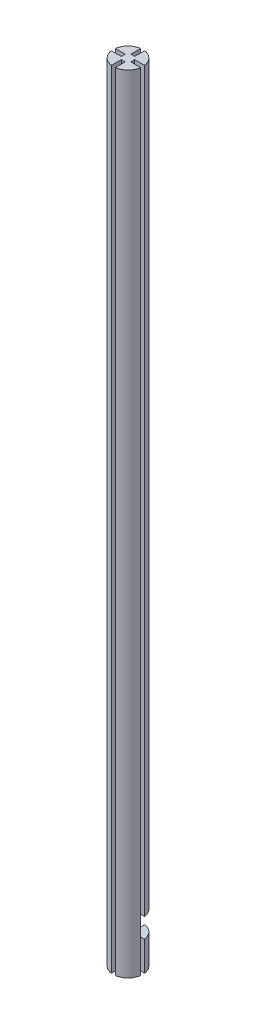
ISO-10303-21;
HEADER;
FILE_DESCRIPTION(('STEP AP214'),'2;1');
FILE_NAME('part.step','',(''),(''),'','','');
FILE_SCHEMA(('AUTOMOTIVE_DESIGN { 1 0 10303 214 1 1 1 1 }'));
ENDSEC;
DATA;
#1=APPLICATION_CONTEXT('core data for automotive mechanical design processes');
#2=APPLICATION_PROTOCOL_DEFINITION('international standard','automotive_design',2000,#1);
#3=PRODUCT_CONTEXT('',#1,'mechanical');
#4=PRODUCT('Part','Part','',(#3));
#5=PRODUCT_RELATED_PRODUCT_CATEGORY('part','',(#4));
#6=PRODUCT_DEFINITION_FORMATION('','',#4);
#7=PRODUCT_DEFINITION_CONTEXT('part definition',#1,'design');
#8=PRODUCT_DEFINITION('design','',#6,#7);
#9=PRODUCT_DEFINITION_SHAPE('','',#8);
#10=(LENGTH_UNIT() NAMED_UNIT(*) SI_UNIT(.MILLI.,.METRE.));
#11=(NAMED_UNIT(*) PLANE_ANGLE_UNIT() SI_UNIT($,.RADIAN.));
#12=(NAMED_UNIT(*) SI_UNIT($,.STERADIAN.) SOLID_ANGLE_UNIT());
#13=UNCERTAINTY_MEASURE_WITH_UNIT(LENGTH_MEASURE(1.E-05),#10,'distance_accuracy_value','');
#14=(GEOMETRIC_REPRESENTATION_CONTEXT(3) GLOBAL_UNCERTAINTY_ASSIGNED_CONTEXT((#13)) GLOBAL_UNIT_ASSIGNED_CONTEXT((#10,
#11,#12)) REPRESENTATION_CONTEXT('',''));
#15=CARTESIAN_POINT('',(0.,0.,0.));
#16=DIRECTION('',(0.,0.,1.));
#17=DIRECTION('',(1.,0.,0.));
#18=AXIS2_PLACEMENT_3D('',#15,#16,#17);
#19=CARTESIAN_POINT('',(74.3303437365925,4000.,-10.));
#20=DIRECTION('',(0.,0.,1.));
#21=DIRECTION('',(1.,0.,0.));
#22=AXIS2_PLACEMENT_3D('',#19,#20,#21);
#23=PLANE('',#22);
#24=DIRECTION('',(0.,-1.,0.));
#25=VECTOR('',#24,1.);
#26=CARTESIAN_POINT('',(74.3303437365925,4000.,-10.));
#27=LINE('',#26,#25);
#28=CARTESIAN_POINT('',(74.3303437365925,150.,-10.0000000000001));
#29=VERTEX_POINT('',#28);
#30=CARTESIAN_POINT('',(74.3303437365925,0.,-10.));
#31=VERTEX_POINT('',#30);
#32=EDGE_CURVE('E266',#29,#31,#27,.T.);
#33=ORIENTED_EDGE('',*,*,#32,.F.);
#34=DIRECTION('',(-1.,0.,0.));
#35=VECTOR('',#34,1.);
#36=CARTESIAN_POINT('',(74.3303437365925,150.,-10.));
#37=LINE('',#36,#35);
#38=CARTESIAN_POINT('',(24.3303437365925,150.,-10.));
#39=VERTEX_POINT('',#38);
#40=EDGE_CURVE('E378',#29,#39,#37,.T.);
#41=ORIENTED_EDGE('',*,*,#40,.T.);
#42=DIRECTION('',(0.,-1.,0.));
#43=VECTOR('',#42,1.);
#44=CARTESIAN_POINT('',(24.3303437365925,4000.,-10.));
#45=LINE('',#44,#43);
#46=CARTESIAN_POINT('',(24.3303437365925,0.,-10.));
#47=VERTEX_POINT('',#46);
#48=EDGE_CURVE('E262',#39,#47,#45,.T.);
#49=ORIENTED_EDGE('',*,*,#48,.T.);
#50=DIRECTION('',(-1.,0.,0.));
#51=VECTOR('',#50,1.);
#52=CARTESIAN_POINT('',(74.3303437365925,0.,-10.));
#53=LINE('',#52,#51);
#54=EDGE_CURVE('E208',#31,#47,#53,.T.);
#55=ORIENTED_EDGE('',*,*,#54,.F.);
#56=EDGE_LOOP('',(#33,#41,#49,#55));
#57=FACE_BOUND('',#56,.T.);
#58=ADVANCED_FACE('F34',(#57),#23,.T.);
#59=CARTESIAN_POINT('',(0.,4000.,0.));
#60=DIRECTION('',(0.,-1.,0.));
#61=DIRECTION('',(0.,0.,-1.));
#62=AXIS2_PLACEMENT_3D('',#59,#60,#61);
#63=CYLINDRICAL_SURFACE('',#62,75.);
#64=CARTESIAN_POINT('',(0.,150.,0.));
#65=DIRECTION('',(0.,1.,0.));
#66=DIRECTION('',(0.,0.,1.));
#67=AXIS2_PLACEMENT_3D('',#64,#65,#66);
#68=CIRCLE('',#67,75.);
#69=CARTESIAN_POINT('',(10.,150.,-74.3303437365925));
#70=VERTEX_POINT('',#69);
#71=EDGE_CURVE('E381',#29,#70,#68,.T.);
#72=ORIENTED_EDGE('',*,*,#71,.F.);
#73=ORIENTED_EDGE('',*,*,#32,.T.);
#74=CARTESIAN_POINT('',(0.,0.,0.));
#75=DIRECTION('',(0.,1.,0.));
#76=DIRECTION('',(0.,0.,1.));
#77=AXIS2_PLACEMENT_3D('',#74,#75,#76);
#78=CIRCLE('',#77,75.);
#79=CARTESIAN_POINT('',(10.,0.,-74.3303437365925));
#80=VERTEX_POINT('',#79);
#81=EDGE_CURVE('E205',#31,#80,#78,.T.);
#82=ORIENTED_EDGE('',*,*,#81,.T.);
#83=DIRECTION('',(0.,-1.,0.));
#84=VECTOR('',#83,1.);
#85=CARTESIAN_POINT('',(10.,4000.,-74.3303437365925));
#86=LINE('',#85,#84);
#87=EDGE_CURVE('E270',#70,#80,#86,.T.);
#88=ORIENTED_EDGE('',*,*,#87,.F.);
#89=EDGE_LOOP('',(#72,#73,#82,#88));
#90=FACE_BOUND('',#89,.T.);
#91=ADVANCED_FACE('F420',(#90),#63,.T.);
#92=CARTESIAN_POINT('',(10.,4000.,-74.3303437365925));
#93=DIRECTION('',(1.,0.,0.));
#94=DIRECTION('',(0.,0.,-1.));
#95=AXIS2_PLACEMENT_3D('',#92,#93,#94);
#96=PLANE('',#95);
#97=DIRECTION('',(0.,0.,1.));
#98=VECTOR('',#97,1.);
#99=CARTESIAN_POINT('',(10.,150.,-74.3303437365925));
#100=LINE('',#99,#98);
#101=CARTESIAN_POINT('',(9.99999999999999,150.,-24.3303437365925));
#102=VERTEX_POINT('',#101);
#103=EDGE_CURVE('E49',#70,#102,#100,.T.);
#104=ORIENTED_EDGE('',*,*,#103,.F.);
#105=ORIENTED_EDGE('',*,*,#87,.T.);
#106=DIRECTION('',(0.,0.,1.));
#107=VECTOR('',#106,1.);
#108=CARTESIAN_POINT('',(10.,0.,-74.3303437365925));
#109=LINE('',#108,#107);
#110=CARTESIAN_POINT('',(9.99999999999999,0.,-24.3303437365925));
#111=VERTEX_POINT('',#110);
#112=EDGE_CURVE('E202',#80,#111,#109,.T.);
#113=ORIENTED_EDGE('',*,*,#112,.T.);
#114=DIRECTION('',(0.,-1.,0.));
#115=VECTOR('',#114,1.);
#116=CARTESIAN_POINT('',(9.99999999999999,4000.,-24.3303437365925));
#117=LINE('',#116,#115);
#118=EDGE_CURVE('E274',#102,#111,#117,.T.);
#119=ORIENTED_EDGE('',*,*,#118,.F.);
#120=EDGE_LOOP('',(#104,#105,#113,#119));
#121=FACE_BOUND('',#120,.T.);
#122=ADVANCED_FACE('F427',(#121),#96,.F.);
#123=CARTESIAN_POINT('',(-9.99999999999999,4000.,-74.3303437365925));
#124=DIRECTION('',(1.,0.,0.));
#125=DIRECTION('',(0.,0.,-1.));
#126=AXIS2_PLACEMENT_3D('',#123,#124,#125);
#127=PLANE('',#126);
#128=DIRECTION('',(0.,0.,1.));
#129=VECTOR('',#128,1.);
#130=CARTESIAN_POINT('',(-9.99999999999999,0.,-74.3303437365925));
#131=LINE('',#130,#129);
#132=CARTESIAN_POINT('',(-9.99999999999998,0.,-74.3303437365925));
#133=VERTEX_POINT('',#132);
#134=CARTESIAN_POINT('',(-10.,0.,-24.3303437365925));
#135=VERTEX_POINT('',#134);
#136=EDGE_CURVE('E195',#133,#135,#131,.T.);
#137=ORIENTED_EDGE('',*,*,#136,.F.);
#138=DIRECTION('',(0.,-1.,0.));
#139=VECTOR('',#138,1.);
#140=CARTESIAN_POINT('',(-9.99999999999998,4000.,-74.3303437365925));
#141=LINE('',#140,#139);
#142=CARTESIAN_POINT('',(-9.99999999999998,4000.,-74.3303437365925));
#143=VERTEX_POINT('',#142);
#144=EDGE_CURVE('E58',#143,#133,#141,.T.);
#145=ORIENTED_EDGE('',*,*,#144,.F.);
#146=DIRECTION('',(0.,0.,1.));
#147=VECTOR('',#146,1.);
#148=CARTESIAN_POINT('',(-9.99999999999999,4000.,-74.3303437365925));
#149=LINE('',#148,#147);
#150=CARTESIAN_POINT('',(-10.,4000.,-24.3303437365925));
#151=VERTEX_POINT('',#150);
#152=EDGE_CURVE('E238',#143,#151,#149,.T.);
#153=ORIENTED_EDGE('',*,*,#152,.T.);
#154=DIRECTION('',(0.,-1.,0.));
#155=VECTOR('',#154,1.);
#156=CARTESIAN_POINT('',(-10.,4000.,-24.3303437365925));
#157=LINE('',#156,#155);
#158=EDGE_CURVE('E120',#151,#135,#157,.T.);
#159=ORIENTED_EDGE('',*,*,#158,.T.);
#160=EDGE_LOOP('',(#137,#145,#153,#159));
#161=FACE_BOUND('',#160,.T.);
#162=ADVANCED_FACE('F36',(#161),#127,.T.);
#163=CARTESIAN_POINT('',(0.,4000.,0.));
#164=DIRECTION('',(0.,-1.,0.));
#165=DIRECTION('',(0.,0.,-1.));
#166=AXIS2_PLACEMENT_3D('',#163,#164,#165);
#167=CYLINDRICAL_SURFACE('',#166,75.);
#168=CARTESIAN_POINT('',(0.,0.,0.));
#169=DIRECTION('',(0.,1.,0.));
#170=DIRECTION('',(0.,0.,1.));
#171=AXIS2_PLACEMENT_3D('',#168,#169,#170);
#172=CIRCLE('',#171,75.);
#173=CARTESIAN_POINT('',(-74.3303437365925,0.,-10.));
#174=VERTEX_POINT('',#173);
#175=EDGE_CURVE('E236',#133,#174,#172,.T.);
#176=ORIENTED_EDGE('',*,*,#175,.T.);
#177=DIRECTION('',(0.,-1.,0.));
#178=VECTOR('',#177,1.);
#179=CARTESIAN_POINT('',(-74.3303437365925,4000.,-10.));
#180=LINE('',#179,#178);
#181=CARTESIAN_POINT('',(-74.3303437365925,4000.,-10.));
#182=VERTEX_POINT('',#181);
#183=EDGE_CURVE('E184',#182,#174,#180,.T.);
#184=ORIENTED_EDGE('',*,*,#183,.F.);
#185=CARTESIAN_POINT('',(0.,4000.,0.));
#186=DIRECTION('',(0.,1.,0.));
#187=DIRECTION('',(0.,0.,1.));
#188=AXIS2_PLACEMENT_3D('',#185,#186,#187);
#189=CIRCLE('',#188,75.);
#190=EDGE_CURVE('E171',#143,#182,#189,.T.);
#191=ORIENTED_EDGE('',*,*,#190,.F.);
#192=ORIENTED_EDGE('',*,*,#144,.T.);
#193=EDGE_LOOP('',(#176,#184,#191,#192));
#194=FACE_BOUND('',#193,.T.);
#195=ADVANCED_FACE('F441',(#194),#167,.T.);
#196=CARTESIAN_POINT('',(-74.3303437365925,4000.,-10.));
#197=DIRECTION('',(0.,0.,-1.));
#198=DIRECTION('',(-1.,0.,0.));
#199=AXIS2_PLACEMENT_3D('',#196,#197,#198);
#200=PLANE('',#199);
#201=DIRECTION('',(1.,0.,0.));
#202=VECTOR('',#201,1.);
#203=CARTESIAN_POINT('',(-74.3303437365925,0.,-10.));
#204=LINE('',#203,#202);
#205=CARTESIAN_POINT('',(-24.3303437365925,0.,-10.));
#206=VERTEX_POINT('',#205);
#207=EDGE_CURVE('E180',#174,#206,#204,.T.);
#208=ORIENTED_EDGE('',*,*,#207,.T.);
#209=DIRECTION('',(0.,-1.,0.));
#210=VECTOR('',#209,1.);
#211=CARTESIAN_POINT('',(-24.3303437365925,4000.,-10.));
#212=LINE('',#211,#210);
#213=CARTESIAN_POINT('',(-24.3303437365925,4000.,-10.));
#214=VERTEX_POINT('',#213);
#215=EDGE_CURVE('E177',#214,#206,#212,.T.);
#216=ORIENTED_EDGE('',*,*,#215,.F.);
#217=DIRECTION('',(1.,0.,0.));
#218=VECTOR('',#217,1.);
#219=CARTESIAN_POINT('',(-74.3303437365925,4000.,-10.));
#220=LINE('',#219,#218);
#221=EDGE_CURVE('E163',#182,#214,#220,.T.);
#222=ORIENTED_EDGE('',*,*,#221,.F.);
#223=ORIENTED_EDGE('',*,*,#183,.T.);
#224=EDGE_LOOP('',(#208,#216,#222,#223));
#225=FACE_BOUND('',#224,.T.);
#226=ADVANCED_FACE('F178',(#225),#200,.F.);
#227=CARTESIAN_POINT('',(-24.3303437365925,4000.,10.));
#228=DIRECTION('',(-1.,0.,0.));
#229=DIRECTION('',(0.,0.,1.));
#230=AXIS2_PLACEMENT_3D('',#227,#228,#229);
#231=PLANE('',#230);
#232=DIRECTION('',(0.,0.,-1.));
#233=VECTOR('',#232,1.);
#234=CARTESIAN_POINT('',(-24.3303437365925,0.,10.));
#235=LINE('',#234,#233);
#236=CARTESIAN_POINT('',(-24.3303437365925,0.,10.));
#237=VERTEX_POINT('',#236);
#238=EDGE_CURVE('E233',#237,#206,#235,.T.);
#239=ORIENTED_EDGE('',*,*,#238,.F.);
#240=DIRECTION('',(0.,-1.,0.));
#241=VECTOR('',#240,1.);
#242=CARTESIAN_POINT('',(-24.3303437365925,4000.,10.));
#243=LINE('',#242,#241);
#244=CARTESIAN_POINT('',(-24.3303437365925,4000.,10.));
#245=VERTEX_POINT('',#244);
#246=EDGE_CURVE('E185',#245,#237,#243,.T.);
#247=ORIENTED_EDGE('',*,*,#246,.F.);
#248=DIRECTION('',(0.,0.,-1.));
#249=VECTOR('',#248,1.);
#250=CARTESIAN_POINT('',(-24.3303437365925,4000.,10.));
#251=LINE('',#250,#249);
#252=EDGE_CURVE('E169',#245,#214,#251,.T.);
#253=ORIENTED_EDGE('',*,*,#252,.T.);
#254=ORIENTED_EDGE('',*,*,#215,.T.);
#255=EDGE_LOOP('',(#239,#247,#253,#254));
#256=FACE_BOUND('',#255,.T.);
#257=ADVANCED_FACE('F187',(#256),#231,.T.);
#258=CARTESIAN_POINT('',(-74.3303437365925,4000.,10.));
#259=DIRECTION('',(0.,0.,-1.));
#260=DIRECTION('',(-1.,0.,0.));
#261=AXIS2_PLACEMENT_3D('',#258,#259,#260);
#262=PLANE('',#261);
#263=DIRECTION('',(1.,0.,0.));
#264=VECTOR('',#263,1.);
#265=CARTESIAN_POINT('',(-74.3303437365925,0.,10.));
#266=LINE('',#265,#264);
#267=CARTESIAN_POINT('',(-74.3303437365925,0.,10.));
#268=VERTEX_POINT('',#267);
#269=EDGE_CURVE('E230',#268,#237,#266,.T.);
#270=ORIENTED_EDGE('',*,*,#269,.F.);
#271=DIRECTION('',(0.,-1.,0.));
#272=VECTOR('',#271,1.);
#273=CARTESIAN_POINT('',(-74.3303437365925,4000.,10.));
#274=LINE('',#273,#272);
#275=CARTESIAN_POINT('',(-74.3303437365925,4000.,10.));
#276=VERTEX_POINT('',#275);
#277=EDGE_CURVE('E243',#276,#268,#274,.T.);
#278=ORIENTED_EDGE('',*,*,#277,.F.);
#279=DIRECTION('',(1.,0.,0.));
#280=VECTOR('',#279,1.);
#281=CARTESIAN_POINT('',(-74.3303437365925,4000.,10.));
#282=LINE('',#281,#280);
#283=EDGE_CURVE('E188',#276,#245,#282,.T.);
#284=ORIENTED_EDGE('',*,*,#283,.T.);
#285=ORIENTED_EDGE('',*,*,#246,.T.);
#286=EDGE_LOOP('',(#270,#278,#284,#285));
#287=FACE_BOUND('',#286,.T.);
#288=ADVANCED_FACE('F477',(#287),#262,.T.);
#289=CARTESIAN_POINT('',(0.,4000.,0.));
#290=DIRECTION('',(0.,-1.,0.));
#291=DIRECTION('',(0.,0.,-1.));
#292=AXIS2_PLACEMENT_3D('',#289,#290,#291);
#293=CYLINDRICAL_SURFACE('',#292,75.);
#294=CARTESIAN_POINT('',(0.,0.,0.));
#295=DIRECTION('',(0.,1.,0.));
#296=DIRECTION('',(0.,0.,1.));
#297=AXIS2_PLACEMENT_3D('',#294,#295,#296);
#298=CIRCLE('',#297,75.);
#299=CARTESIAN_POINT('',(-10.,0.,74.3303437365925));
#300=VERTEX_POINT('',#299);
#301=EDGE_CURVE('E228',#268,#300,#298,.T.);
#302=ORIENTED_EDGE('',*,*,#301,.T.);
#303=DIRECTION('',(0.,-1.,0.));
#304=VECTOR('',#303,1.);
#305=CARTESIAN_POINT('',(-10.,4000.,74.3303437365925));
#306=LINE('',#305,#304);
#307=CARTESIAN_POINT('',(-10.,4000.,74.3303437365925));
#308=VERTEX_POINT('',#307);
#309=EDGE_CURVE('E245',#308,#300,#306,.T.);
#310=ORIENTED_EDGE('',*,*,#309,.F.);
#311=CARTESIAN_POINT('',(0.,4000.,0.));
#312=DIRECTION('',(0.,1.,0.));
#313=DIRECTION('',(0.,0.,1.));
#314=AXIS2_PLACEMENT_3D('',#311,#312,#313);
#315=CIRCLE('',#314,75.);
#316=EDGE_CURVE('E190',#276,#308,#315,.T.);
#317=ORIENTED_EDGE('',*,*,#316,.F.);
#318=ORIENTED_EDGE('',*,*,#277,.T.);
#319=EDGE_LOOP('',(#302,#310,#317,#318));
#320=FACE_BOUND('',#319,.T.);
#321=ADVANCED_FACE('F337',(#320),#293,.T.);
#322=CARTESIAN_POINT('',(-10.,4000.,74.3303437365925));
#323=DIRECTION('',(-1.,0.,0.));
#324=DIRECTION('',(0.,0.,1.));
#325=AXIS2_PLACEMENT_3D('',#322,#323,#324);
#326=PLANE('',#325);
#327=DIRECTION('',(0.,0.,-1.));
#328=VECTOR('',#327,1.);
#329=CARTESIAN_POINT('',(-10.,0.,74.3303437365925));
#330=LINE('',#329,#328);
#331=CARTESIAN_POINT('',(-9.99999999999999,0.,24.3303437365925));
#332=VERTEX_POINT('',#331);
#333=EDGE_CURVE('E225',#300,#332,#330,.T.);
#334=ORIENTED_EDGE('',*,*,#333,.T.);
#335=DIRECTION('',(0.,-1.,0.));
#336=VECTOR('',#335,1.);
#337=CARTESIAN_POINT('',(-9.99999999999999,4000.,24.3303437365925));
#338=LINE('',#337,#336);
#339=CARTESIAN_POINT('',(-9.99999999999999,4000.,24.3303437365925));
#340=VERTEX_POINT('',#339);
#341=EDGE_CURVE('E248',#340,#332,#338,.T.);
#342=ORIENTED_EDGE('',*,*,#341,.F.);
#343=DIRECTION('',(0.,0.,-1.));
#344=VECTOR('',#343,1.);
#345=CARTESIAN_POINT('',(-10.,4000.,74.3303437365925));
#346=LINE('',#345,#344);
#347=EDGE_CURVE('E330',#308,#340,#346,.T.);
#348=ORIENTED_EDGE('',*,*,#347,.F.);
#349=ORIENTED_EDGE('',*,*,#309,.T.);
#350=EDGE_LOOP('',(#334,#342,#348,#349));
#351=FACE_BOUND('',#350,.T.);
#352=ADVANCED_FACE('F341',(#351),#326,.F.);
#353=CARTESIAN_POINT('',(10.,4000.,24.3303437365925));
#354=DIRECTION('',(0.,0.,1.));
#355=DIRECTION('',(1.,0.,0.));
#356=AXIS2_PLACEMENT_3D('',#353,#354,#355);
#357=PLANE('',#356);
#358=DIRECTION('',(-1.,0.,0.));
#359=VECTOR('',#358,1.);
#360=CARTESIAN_POINT('',(10.,0.,24.3303437365925));
#361=LINE('',#360,#359);
#362=CARTESIAN_POINT('',(10.,0.,24.3303437365925));
#363=VERTEX_POINT('',#362);
#364=EDGE_CURVE('E222',#363,#332,#361,.T.);
#365=ORIENTED_EDGE('',*,*,#364,.F.);
#366=DIRECTION('',(0.,-1.,0.));
#367=VECTOR('',#366,1.);
#368=CARTESIAN_POINT('',(10.,4000.,24.3303437365925));
#369=LINE('',#368,#367);
#370=CARTESIAN_POINT('',(10.,4000.,24.3303437365925));
#371=VERTEX_POINT('',#370);
#372=EDGE_CURVE('E250',#371,#363,#369,.T.);
#373=ORIENTED_EDGE('',*,*,#372,.F.);
#374=DIRECTION('',(-1.,0.,0.));
#375=VECTOR('',#374,1.);
#376=CARTESIAN_POINT('',(10.,4000.,24.3303437365925));
#377=LINE('',#376,#375);
#378=EDGE_CURVE('E327',#371,#340,#377,.T.);
#379=ORIENTED_EDGE('',*,*,#378,.T.);
#380=ORIENTED_EDGE('',*,*,#341,.T.);
#381=EDGE_LOOP('',(#365,#373,#379,#380));
#382=FACE_BOUND('',#381,.T.);
#383=ADVANCED_FACE('F344',(#382),#357,.T.);
#384=CARTESIAN_POINT('',(10.,4000.,74.3303437365925));
#385=DIRECTION('',(-1.,0.,0.));
#386=DIRECTION('',(0.,0.,1.));
#387=AXIS2_PLACEMENT_3D('',#384,#385,#386);
#388=PLANE('',#387);
#389=DIRECTION('',(0.,0.,-1.));
#390=VECTOR('',#389,1.);
#391=CARTESIAN_POINT('',(10.,0.,74.3303437365925));
#392=LINE('',#391,#390);
#393=CARTESIAN_POINT('',(10.,0.,74.3303437365925));
#394=VERTEX_POINT('',#393);
#395=EDGE_CURVE('E219',#394,#363,#392,.T.);
#396=ORIENTED_EDGE('',*,*,#395,.F.);
#397=DIRECTION('',(0.,-1.,0.));
#398=VECTOR('',#397,1.);
#399=CARTESIAN_POINT('',(10.,4000.,74.3303437365925));
#400=LINE('',#399,#398);
#401=CARTESIAN_POINT('',(10.,4000.,74.3303437365925));
#402=VERTEX_POINT('',#401);
#403=EDGE_CURVE('E252',#402,#394,#400,.T.);
#404=ORIENTED_EDGE('',*,*,#403,.F.);
#405=DIRECTION('',(0.,0.,-1.));
#406=VECTOR('',#405,1.);
#407=CARTESIAN_POINT('',(10.,4000.,74.3303437365925));
#408=LINE('',#407,#406);
#409=EDGE_CURVE('E324',#402,#371,#408,.T.);
#410=ORIENTED_EDGE('',*,*,#409,.T.);
#411=ORIENTED_EDGE('',*,*,#372,.T.);
#412=EDGE_LOOP('',(#396,#404,#410,#411));
#413=FACE_BOUND('',#412,.T.);
#414=ADVANCED_FACE('F348',(#413),#388,.T.);
#415=CARTESIAN_POINT('',(0.,4000.,0.));
#416=DIRECTION('',(0.,-1.,0.));
#417=DIRECTION('',(0.,0.,-1.));
#418=AXIS2_PLACEMENT_3D('',#415,#416,#417);
#419=CYLINDRICAL_SURFACE('',#418,75.);
#420=CARTESIAN_POINT('',(0.,0.,0.));
#421=DIRECTION('',(0.,1.,0.));
#422=DIRECTION('',(0.,0.,1.));
#423=AXIS2_PLACEMENT_3D('',#420,#421,#422);
#424=CIRCLE('',#423,75.);
#425=CARTESIAN_POINT('',(74.3303437365925,0.,10.));
#426=VERTEX_POINT('',#425);
#427=EDGE_CURVE('E217',#394,#426,#424,.T.);
#428=ORIENTED_EDGE('',*,*,#427,.T.);
#429=DIRECTION('',(0.,-1.,0.));
#430=VECTOR('',#429,1.);
#431=CARTESIAN_POINT('',(74.3303437365925,4000.,10.));
#432=LINE('',#431,#430);
#433=CARTESIAN_POINT('',(74.3303437365925,4000.,10.));
#434=VERTEX_POINT('',#433);
#435=EDGE_CURVE('E254',#434,#426,#432,.T.);
#436=ORIENTED_EDGE('',*,*,#435,.F.);
#437=CARTESIAN_POINT('',(0.,4000.,0.));
#438=DIRECTION('',(0.,1.,0.));
#439=DIRECTION('',(0.,0.,1.));
#440=AXIS2_PLACEMENT_3D('',#437,#438,#439);
#441=CIRCLE('',#440,75.);
#442=EDGE_CURVE('E322',#402,#434,#441,.T.);
#443=ORIENTED_EDGE('',*,*,#442,.F.);
#444=ORIENTED_EDGE('',*,*,#403,.T.);
#445=EDGE_LOOP('',(#428,#436,#443,#444));
#446=FACE_BOUND('',#445,.T.);
#447=ADVANCED_FACE('F353',(#446),#419,.T.);
#448=CARTESIAN_POINT('',(74.3303437365925,4000.,10.));
#449=DIRECTION('',(0.,0.,1.));
#450=DIRECTION('',(1.,0.,0.));
#451=AXIS2_PLACEMENT_3D('',#448,#449,#450);
#452=PLANE('',#451);
#453=DIRECTION('',(-1.,0.,0.));
#454=VECTOR('',#453,1.);
#455=CARTESIAN_POINT('',(74.3303437365925,0.,10.));
#456=LINE('',#455,#454);
#457=CARTESIAN_POINT('',(24.3303437365925,0.,9.99999999999999));
#458=VERTEX_POINT('',#457);
#459=EDGE_CURVE('E214',#426,#458,#456,.T.);
#460=ORIENTED_EDGE('',*,*,#459,.T.);
#461=DIRECTION('',(0.,-1.,0.));
#462=VECTOR('',#461,1.);
#463=CARTESIAN_POINT('',(24.3303437365925,4000.,9.99999999999999));
#464=LINE('',#463,#462);
#465=CARTESIAN_POINT('',(24.3303437365925,4000.,9.99999999999999));
#466=VERTEX_POINT('',#465);
#467=EDGE_CURVE('E257',#466,#458,#464,.T.);
#468=ORIENTED_EDGE('',*,*,#467,.F.);
#469=DIRECTION('',(-1.,0.,0.));
#470=VECTOR('',#469,1.);
#471=CARTESIAN_POINT('',(74.3303437365925,4000.,10.));
#472=LINE('',#471,#470);
#473=EDGE_CURVE('E320',#434,#466,#472,.T.);
#474=ORIENTED_EDGE('',*,*,#473,.F.);
#475=ORIENTED_EDGE('',*,*,#435,.T.);
#476=EDGE_LOOP('',(#460,#468,#474,#475));
#477=FACE_BOUND('',#476,.T.);
#478=ADVANCED_FACE('F359',(#477),#452,.F.);
#479=CARTESIAN_POINT('',(24.3303437365925,4000.,-10.));
#480=DIRECTION('',(1.,0.,0.));
#481=DIRECTION('',(0.,0.,-1.));
#482=AXIS2_PLACEMENT_3D('',#479,#480,#481);
#483=PLANE('',#482);
#484=DIRECTION('',(0.,0.,1.));
#485=VECTOR('',#484,1.);
#486=CARTESIAN_POINT('',(24.3303437365925,250.,-10.));
#487=LINE('',#486,#485);
#488=CARTESIAN_POINT('',(24.3303437365925,250.,-10.));
#489=VERTEX_POINT('',#488);
#490=CARTESIAN_POINT('',(24.3303437365925,250.,0.));
#491=VERTEX_POINT('',#490);
#492=EDGE_CURVE('E199',#489,#491,#487,.T.);
#493=ORIENTED_EDGE('',*,*,#492,.F.);
#494=CARTESIAN_POINT('',(24.3303437365925,4000.,-10.));
#495=VERTEX_POINT('',#494);
#496=EDGE_CURVE('E259',#495,#489,#45,.T.);
#497=ORIENTED_EDGE('',*,*,#496,.F.);
#498=DIRECTION('',(0.,0.,1.));
#499=VECTOR('',#498,1.);
#500=CARTESIAN_POINT('',(24.3303437365925,4000.,-10.));
#501=LINE('',#500,#499);
#502=EDGE_CURVE('E317',#495,#466,#501,.T.);
#503=ORIENTED_EDGE('',*,*,#502,.T.);
#504=ORIENTED_EDGE('',*,*,#467,.T.);
#505=DIRECTION('',(0.,0.,1.));
#506=VECTOR('',#505,1.);
#507=CARTESIAN_POINT('',(24.3303437365925,0.,-10.));
#508=LINE('',#507,#506);
#509=EDGE_CURVE('E211',#47,#458,#508,.T.);
#510=ORIENTED_EDGE('',*,*,#509,.F.);
#511=ORIENTED_EDGE('',*,*,#48,.F.);
#512=DIRECTION('',(0.,0.,1.));
#513=VECTOR('',#512,1.);
#514=CARTESIAN_POINT('',(24.3303437365925,150.,-10.));
#515=LINE('',#514,#513);
#516=CARTESIAN_POINT('',(24.3303437365925,150.,0.));
#517=VERTEX_POINT('',#516);
#518=EDGE_CURVE('E302',#39,#517,#515,.T.);
#519=ORIENTED_EDGE('',*,*,#518,.T.);
#520=DIRECTION('',(0.,1.,0.));
#521=VECTOR('',#520,1.);
#522=CARTESIAN_POINT('',(24.3303437365925,4000.,0.));
#523=LINE('',#522,#521);
#524=EDGE_CURVE('E11',#517,#491,#523,.T.);
#525=ORIENTED_EDGE('',*,*,#524,.T.);
#526=EDGE_LOOP('',(#493,#497,#503,#504,#510,#511,#519,#525));
#527=FACE_BOUND('',#526,.T.);
#528=ADVANCED_FACE('F364',(#527),#483,.T.);
#529=DIRECTION('',(-1.,0.,0.));
#530=VECTOR('',#529,1.);
#531=CARTESIAN_POINT('',(74.3303437365925,250.,-10.));
#532=LINE('',#531,#530);
#533=CARTESIAN_POINT('',(74.3303437365925,250.,-10.0000000000001));
#534=VERTEX_POINT('',#533);
#535=EDGE_CURVE('E370',#534,#489,#532,.T.);
#536=ORIENTED_EDGE('',*,*,#535,.F.);
#537=CARTESIAN_POINT('',(74.3303437365925,4000.,-10.));
#538=VERTEX_POINT('',#537);
#539=EDGE_CURVE('E263',#538,#534,#27,.T.);
#540=ORIENTED_EDGE('',*,*,#539,.F.);
#541=DIRECTION('',(-1.,0.,0.));
#542=VECTOR('',#541,1.);
#543=CARTESIAN_POINT('',(74.3303437365925,4000.,-10.));
#544=LINE('',#543,#542);
#545=EDGE_CURVE('E314',#538,#495,#544,.T.);
#546=ORIENTED_EDGE('',*,*,#545,.T.);
#547=ORIENTED_EDGE('',*,*,#496,.T.);
#548=EDGE_LOOP('',(#536,#540,#546,#547));
#549=FACE_BOUND('',#548,.T.);
#550=ADVANCED_FACE('F367',(#549),#23,.T.);
#551=ORIENTED_EDGE('',*,*,#539,.T.);
#552=CARTESIAN_POINT('',(0.,250.,0.));
#553=DIRECTION('',(0.,1.,0.));
#554=DIRECTION('',(0.,0.,1.));
#555=AXIS2_PLACEMENT_3D('',#552,#553,#554);
#556=CIRCLE('',#555,75.);
#557=CARTESIAN_POINT('',(10.,250.,-74.3303437365925));
#558=VERTEX_POINT('',#557);
#559=EDGE_CURVE('E301',#534,#558,#556,.T.);
#560=ORIENTED_EDGE('',*,*,#559,.T.);
#561=CARTESIAN_POINT('',(10.,4000.,-74.3303437365925));
#562=VERTEX_POINT('',#561);
#563=EDGE_CURVE('E267',#562,#558,#86,.T.);
#564=ORIENTED_EDGE('',*,*,#563,.F.);
#565=CARTESIAN_POINT('',(0.,4000.,0.));
#566=DIRECTION('',(0.,1.,0.));
#567=DIRECTION('',(0.,0.,1.));
#568=AXIS2_PLACEMENT_3D('',#565,#566,#567);
#569=CIRCLE('',#568,75.);
#570=EDGE_CURVE('E308',#538,#562,#569,.T.);
#571=ORIENTED_EDGE('',*,*,#570,.F.);
#572=EDGE_LOOP('',(#551,#560,#564,#571));
#573=FACE_BOUND('',#572,.T.);
#574=ADVANCED_FACE('F454',(#573),#63,.T.);
#575=ORIENTED_EDGE('',*,*,#563,.T.);
#576=DIRECTION('',(0.,0.,1.));
#577=VECTOR('',#576,1.);
#578=CARTESIAN_POINT('',(10.,250.,-74.3303437365925));
#579=LINE('',#578,#577);
#580=CARTESIAN_POINT('',(9.99999999999999,250.,-24.3303437365925));
#581=VERTEX_POINT('',#580);
#582=EDGE_CURVE('E290',#558,#581,#579,.T.);
#583=ORIENTED_EDGE('',*,*,#582,.T.);
#584=CARTESIAN_POINT('',(9.99999999999999,4000.,-24.3303437365925));
#585=VERTEX_POINT('',#584);
#586=EDGE_CURVE('E271',#585,#581,#117,.T.);
#587=ORIENTED_EDGE('',*,*,#586,.F.);
#588=DIRECTION('',(0.,0.,1.));
#589=VECTOR('',#588,1.);
#590=CARTESIAN_POINT('',(10.,4000.,-74.3303437365925));
#591=LINE('',#590,#589);
#592=EDGE_CURVE('E306',#562,#585,#591,.T.);
#593=ORIENTED_EDGE('',*,*,#592,.F.);
#594=EDGE_LOOP('',(#575,#583,#587,#593));
#595=FACE_BOUND('',#594,.T.);
#596=ADVANCED_FACE('F298',(#595),#96,.F.);
#597=CARTESIAN_POINT('',(-10.,4000.,-24.3303437365925));
#598=DIRECTION('',(0.,0.,-1.));
#599=DIRECTION('',(-1.,0.,0.));
#600=AXIS2_PLACEMENT_3D('',#597,#598,#599);
#601=PLANE('',#600);
#602=DIRECTION('',(1.,0.,0.));
#603=VECTOR('',#602,1.);
#604=CARTESIAN_POINT('',(-10.,250.,-24.3303437365925));
#605=LINE('',#604,#603);
#606=CARTESIAN_POINT('',(0.,250.,-24.3303437365925));
#607=VERTEX_POINT('',#606);
#608=EDGE_CURVE('E42',#607,#581,#605,.T.);
#609=ORIENTED_EDGE('',*,*,#608,.F.);
#610=DIRECTION('',(0.,-1.,0.));
#611=VECTOR('',#610,1.);
#612=CARTESIAN_POINT('',(0.,4000.,-24.3303437365925));
#613=LINE('',#612,#611);
#614=CARTESIAN_POINT('',(0.,150.,-24.3303437365925));
#615=VERTEX_POINT('',#614);
#616=EDGE_CURVE('E277',#607,#615,#613,.T.);
#617=ORIENTED_EDGE('',*,*,#616,.T.);
#618=DIRECTION('',(1.,0.,0.));
#619=VECTOR('',#618,1.);
#620=CARTESIAN_POINT('',(-10.,150.,-24.3303437365925));
#621=LINE('',#620,#619);
#622=EDGE_CURVE('E240',#615,#102,#621,.T.);
#623=ORIENTED_EDGE('',*,*,#622,.T.);
#624=ORIENTED_EDGE('',*,*,#118,.T.);
#625=DIRECTION('',(1.,0.,0.));
#626=VECTOR('',#625,1.);
#627=CARTESIAN_POINT('',(-10.,0.,-24.3303437365925));
#628=LINE('',#627,#626);
#629=EDGE_CURVE('E198',#135,#111,#628,.T.);
#630=ORIENTED_EDGE('',*,*,#629,.F.);
#631=ORIENTED_EDGE('',*,*,#158,.F.);
#632=DIRECTION('',(1.,0.,0.));
#633=VECTOR('',#632,1.);
#634=CARTESIAN_POINT('',(-10.,4000.,-24.3303437365925));
#635=LINE('',#634,#633);
#636=EDGE_CURVE('E305',#151,#585,#635,.T.);
#637=ORIENTED_EDGE('',*,*,#636,.T.);
#638=ORIENTED_EDGE('',*,*,#586,.T.);
#639=EDGE_LOOP('',(#609,#617,#623,#624,#630,#631,#637,#638));
#640=FACE_BOUND('',#639,.T.);
#641=ADVANCED_FACE('F304',(#640),#601,.T.);
#642=CARTESIAN_POINT('',(0.,4000.,0.));
#643=DIRECTION('',(0.,1.,0.));
#644=DIRECTION('',(0.,0.,1.));
#645=AXIS2_PLACEMENT_3D('',#642,#643,#644);
#646=PLANE('',#645);
#647=ORIENTED_EDGE('',*,*,#152,.F.);
#648=ORIENTED_EDGE('',*,*,#190,.T.);
#649=ORIENTED_EDGE('',*,*,#221,.T.);
#650=ORIENTED_EDGE('',*,*,#252,.F.);
#651=ORIENTED_EDGE('',*,*,#283,.F.);
#652=ORIENTED_EDGE('',*,*,#316,.T.);
#653=ORIENTED_EDGE('',*,*,#347,.T.);
#654=ORIENTED_EDGE('',*,*,#378,.F.);
#655=ORIENTED_EDGE('',*,*,#409,.F.);
#656=ORIENTED_EDGE('',*,*,#442,.T.);
#657=ORIENTED_EDGE('',*,*,#473,.T.);
#658=ORIENTED_EDGE('',*,*,#502,.F.);
#659=ORIENTED_EDGE('',*,*,#545,.F.);
#660=ORIENTED_EDGE('',*,*,#570,.T.);
#661=ORIENTED_EDGE('',*,*,#592,.T.);
#662=ORIENTED_EDGE('',*,*,#636,.F.);
#663=EDGE_LOOP('',(#647,#648,#649,#650,#651,#652,#653,#654,#655,#656,#657,#658,#659,#660,#661,#662));
#664=FACE_BOUND('',#663,.T.);
#665=ADVANCED_FACE('F166',(#664),#646,.T.);
#666=CARTESIAN_POINT('',(0.,0.,0.));
#667=DIRECTION('',(0.,1.,0.));
#668=DIRECTION('',(0.,0.,1.));
#669=AXIS2_PLACEMENT_3D('',#666,#667,#668);
#670=PLANE('',#669);
#671=ORIENTED_EDGE('',*,*,#136,.T.);
#672=ORIENTED_EDGE('',*,*,#629,.T.);
#673=ORIENTED_EDGE('',*,*,#112,.F.);
#674=ORIENTED_EDGE('',*,*,#81,.F.);
#675=ORIENTED_EDGE('',*,*,#54,.T.);
#676=ORIENTED_EDGE('',*,*,#509,.T.);
#677=ORIENTED_EDGE('',*,*,#459,.F.);
#678=ORIENTED_EDGE('',*,*,#427,.F.);
#679=ORIENTED_EDGE('',*,*,#395,.T.);
#680=ORIENTED_EDGE('',*,*,#364,.T.);
#681=ORIENTED_EDGE('',*,*,#333,.F.);
#682=ORIENTED_EDGE('',*,*,#301,.F.);
#683=ORIENTED_EDGE('',*,*,#269,.T.);
#684=ORIENTED_EDGE('',*,*,#238,.T.);
#685=ORIENTED_EDGE('',*,*,#207,.F.);
#686=ORIENTED_EDGE('',*,*,#175,.F.);
#687=EDGE_LOOP('',(#671,#672,#673,#674,#675,#676,#677,#678,#679,#680,#681,#682,#683,#684,#685,#686));
#688=FACE_BOUND('',#687,.T.);
#689=ADVANCED_FACE('F424',(#688),#670,.F.);
#690=CARTESIAN_POINT('',(0.,250.,0.));
#691=DIRECTION('',(0.,1.,0.));
#692=DIRECTION('',(0.,0.,1.));
#693=AXIS2_PLACEMENT_3D('',#690,#691,#692);
#694=PLANE('',#693);
#695=ORIENTED_EDGE('',*,*,#492,.T.);
#696=DIRECTION('',(1.,0.,0.));
#697=VECTOR('',#696,1.);
#698=CARTESIAN_POINT('',(74.3303437365925,250.,0.));
#699=LINE('',#698,#697);
#700=CARTESIAN_POINT('',(0.,250.,0.));
#701=VERTEX_POINT('',#700);
#702=EDGE_CURVE('E390',#701,#491,#699,.T.);
#703=ORIENTED_EDGE('',*,*,#702,.F.);
#704=DIRECTION('',(0.,0.,1.));
#705=VECTOR('',#704,1.);
#706=CARTESIAN_POINT('',(0.,250.,-74.3303437365925));
#707=LINE('',#706,#705);
#708=EDGE_CURVE('E295',#607,#701,#707,.T.);
#709=ORIENTED_EDGE('',*,*,#708,.F.);
#710=ORIENTED_EDGE('',*,*,#608,.T.);
#711=ORIENTED_EDGE('',*,*,#582,.F.);
#712=ORIENTED_EDGE('',*,*,#559,.F.);
#713=ORIENTED_EDGE('',*,*,#535,.T.);
#714=EDGE_LOOP('',(#695,#703,#709,#710,#711,#712,#713));
#715=FACE_BOUND('',#714,.T.);
#716=ADVANCED_FACE('F287',(#715),#694,.F.);
#717=CARTESIAN_POINT('',(0.,150.,0.));
#718=DIRECTION('',(0.,1.,0.));
#719=DIRECTION('',(0.,0.,1.));
#720=AXIS2_PLACEMENT_3D('',#717,#718,#719);
#721=PLANE('',#720);
#722=ORIENTED_EDGE('',*,*,#40,.F.);
#723=ORIENTED_EDGE('',*,*,#71,.T.);
#724=ORIENTED_EDGE('',*,*,#103,.T.);
#725=ORIENTED_EDGE('',*,*,#622,.F.);
#726=DIRECTION('',(0.,0.,1.));
#727=VECTOR('',#726,1.);
#728=CARTESIAN_POINT('',(0.,150.,-74.3303437365925));
#729=LINE('',#728,#727);
#730=CARTESIAN_POINT('',(0.,150.,0.));
#731=VERTEX_POINT('',#730);
#732=EDGE_CURVE('E387',#615,#731,#729,.T.);
#733=ORIENTED_EDGE('',*,*,#732,.T.);
#734=DIRECTION('',(1.,0.,0.));
#735=VECTOR('',#734,1.);
#736=CARTESIAN_POINT('',(74.3303437365925,150.,0.));
#737=LINE('',#736,#735);
#738=EDGE_CURVE('E391',#731,#517,#737,.T.);
#739=ORIENTED_EDGE('',*,*,#738,.T.);
#740=ORIENTED_EDGE('',*,*,#518,.F.);
#741=EDGE_LOOP('',(#722,#723,#724,#725,#733,#739,#740));
#742=FACE_BOUND('',#741,.T.);
#743=ADVANCED_FACE('F409',(#742),#721,.T.);
#744=CARTESIAN_POINT('',(74.3303437365925,250.,0.));
#745=DIRECTION('',(0.,0.,-1.));
#746=DIRECTION('',(-1.,0.,0.));
#747=AXIS2_PLACEMENT_3D('',#744,#745,#746);
#748=PLANE('',#747);
#749=ORIENTED_EDGE('',*,*,#738,.F.);
#750=DIRECTION('',(0.,-1.,0.));
#751=VECTOR('',#750,1.);
#752=CARTESIAN_POINT('',(0.,250.,0.));
#753=LINE('',#752,#751);
#754=EDGE_CURVE('E384',#701,#731,#753,.T.);
#755=ORIENTED_EDGE('',*,*,#754,.F.);
#756=ORIENTED_EDGE('',*,*,#702,.T.);
#757=ORIENTED_EDGE('',*,*,#524,.F.);
#758=EDGE_LOOP('',(#749,#755,#756,#757));
#759=FACE_BOUND('',#758,.T.);
#760=ADVANCED_FACE('F399',(#759),#748,.T.);
#761=CARTESIAN_POINT('',(0.,250.,-74.3303437365925));
#762=DIRECTION('',(1.,0.,0.));
#763=DIRECTION('',(0.,0.,-1.));
#764=AXIS2_PLACEMENT_3D('',#761,#762,#763);
#765=PLANE('',#764);
#766=ORIENTED_EDGE('',*,*,#708,.T.);
#767=ORIENTED_EDGE('',*,*,#754,.T.);
#768=ORIENTED_EDGE('',*,*,#732,.F.);
#769=ORIENTED_EDGE('',*,*,#616,.F.);
#770=EDGE_LOOP('',(#766,#767,#768,#769));
#771=FACE_BOUND('',#770,.T.);
#772=ADVANCED_FACE('F436',(#771),#765,.T.);
#773=CLOSED_SHELL('',(#58,#91,#122,#162,#195,#226,#257,#288,#321,#352,#383,#414,#447,#478,#528,
#550,#574,#596,#641,#665,#689,#716,#743,#760,#772));
#774=MANIFOLD_SOLID_BREP('B2',#773);
#775=ADVANCED_BREP_SHAPE_REPRESENTATION('',(#18,#774),#14);
#776=SHAPE_DEFINITION_REPRESENTATION(#9,#775);
ENDSEC;
END-ISO-10303-21;
